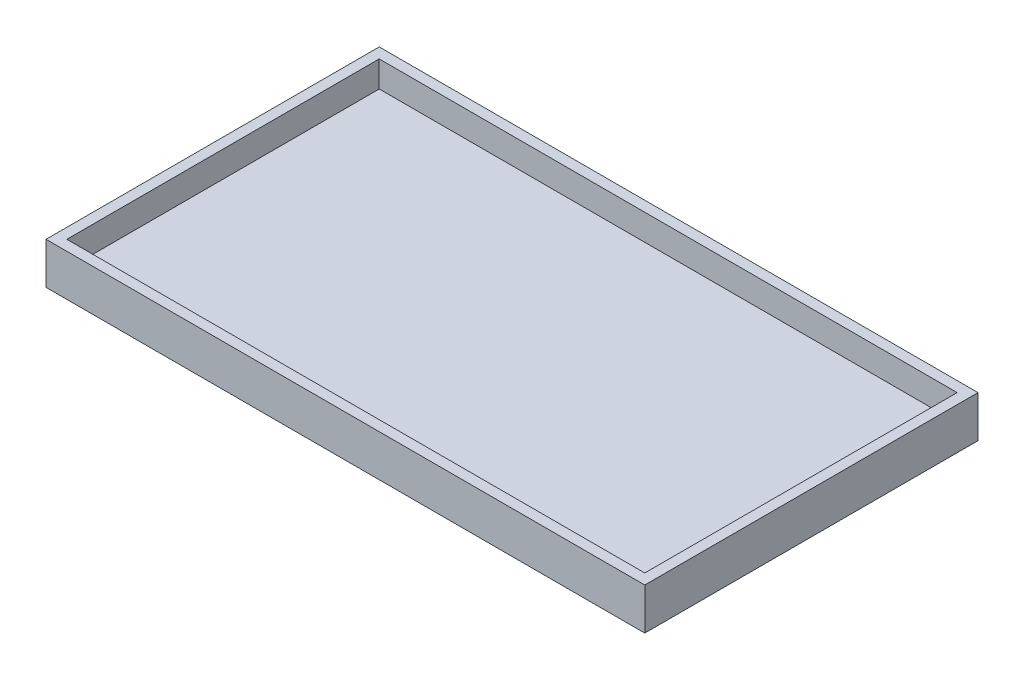
ISO-10303-21;
HEADER;
FILE_DESCRIPTION(('STEP AP214'),'2;1');
FILE_NAME('part.step','',(''),(''),'','','');
FILE_SCHEMA(('AUTOMOTIVE_DESIGN { 1 0 10303 214 1 1 1 1 }'));
ENDSEC;
DATA;
#1=APPLICATION_CONTEXT('core data for automotive mechanical design processes');
#2=APPLICATION_PROTOCOL_DEFINITION('international standard','automotive_design',2000,#1);
#3=PRODUCT_CONTEXT('',#1,'mechanical');
#4=PRODUCT('Part','Part','',(#3));
#5=PRODUCT_RELATED_PRODUCT_CATEGORY('part','',(#4));
#6=PRODUCT_DEFINITION_FORMATION('','',#4);
#7=PRODUCT_DEFINITION_CONTEXT('part definition',#1,'design');
#8=PRODUCT_DEFINITION('design','',#6,#7);
#9=PRODUCT_DEFINITION_SHAPE('','',#8);
#10=(LENGTH_UNIT() NAMED_UNIT(*) SI_UNIT(.MILLI.,.METRE.));
#11=(NAMED_UNIT(*) PLANE_ANGLE_UNIT() SI_UNIT($,.RADIAN.));
#12=(NAMED_UNIT(*) SI_UNIT($,.STERADIAN.) SOLID_ANGLE_UNIT());
#13=UNCERTAINTY_MEASURE_WITH_UNIT(LENGTH_MEASURE(1.E-05),#10,'distance_accuracy_value','');
#14=(GEOMETRIC_REPRESENTATION_CONTEXT(3) GLOBAL_UNCERTAINTY_ASSIGNED_CONTEXT((#13)) GLOBAL_UNIT_ASSIGNED_CONTEXT((#10,
#11,#12)) REPRESENTATION_CONTEXT('',''));
#15=CARTESIAN_POINT('',(0.,0.,0.));
#16=DIRECTION('',(0.,0.,1.));
#17=DIRECTION('',(1.,0.,0.));
#18=AXIS2_PLACEMENT_3D('',#15,#16,#17);
#19=CARTESIAN_POINT('',(-57.5,3.,-32.));
#20=DIRECTION('',(1.,0.,0.));
#21=DIRECTION('',(0.,0.,-1.));
#22=AXIS2_PLACEMENT_3D('',#19,#20,#21);
#23=PLANE('',#22);
#24=DIRECTION('',(0.,0.,1.));
#25=VECTOR('',#24,1.);
#26=CARTESIAN_POINT('',(-57.5,0.,-32.));
#27=LINE('',#26,#25);
#28=CARTESIAN_POINT('',(-57.5,0.,-32.));
#29=VERTEX_POINT('',#28);
#30=CARTESIAN_POINT('',(-57.5,0.,32.));
#31=VERTEX_POINT('',#30);
#32=EDGE_CURVE('E143',#29,#31,#27,.T.);
#33=ORIENTED_EDGE('',*,*,#32,.T.);
#34=DIRECTION('',(0.,-1.,0.));
#35=VECTOR('',#34,1.);
#36=CARTESIAN_POINT('',(-57.5,3.,32.));
#37=LINE('',#36,#35);
#38=CARTESIAN_POINT('',(-57.5,8.,32.));
#39=VERTEX_POINT('',#38);
#40=EDGE_CURVE('E11',#39,#31,#37,.T.);
#41=ORIENTED_EDGE('',*,*,#40,.F.);
#42=DIRECTION('',(0.,0.,1.));
#43=VECTOR('',#42,1.);
#44=CARTESIAN_POINT('',(-57.5,8.,32.));
#45=LINE('',#44,#43);
#46=CARTESIAN_POINT('',(-57.5,8.,-32.));
#47=VERTEX_POINT('',#46);
#48=EDGE_CURVE('E137',#47,#39,#45,.T.);
#49=ORIENTED_EDGE('',*,*,#48,.F.);
#50=DIRECTION('',(0.,-1.,0.));
#51=VECTOR('',#50,1.);
#52=CARTESIAN_POINT('',(-57.5,3.,-32.));
#53=LINE('',#52,#51);
#54=EDGE_CURVE('E152',#47,#29,#53,.T.);
#55=ORIENTED_EDGE('',*,*,#54,.T.);
#56=EDGE_LOOP('',(#33,#41,#49,#55));
#57=FACE_BOUND('',#56,.T.);
#58=ADVANCED_FACE('F32',(#57),#23,.F.);
#59=CARTESIAN_POINT('',(-57.5,3.,32.));
#60=DIRECTION('',(0.,0.,-1.));
#61=DIRECTION('',(-1.,0.,0.));
#62=AXIS2_PLACEMENT_3D('',#59,#60,#61);
#63=PLANE('',#62);
#64=DIRECTION('',(1.,0.,0.));
#65=VECTOR('',#64,1.);
#66=CARTESIAN_POINT('',(-57.5,0.,32.));
#67=LINE('',#66,#65);
#68=CARTESIAN_POINT('',(57.5,0.,32.));
#69=VERTEX_POINT('',#68);
#70=EDGE_CURVE('E146',#31,#69,#67,.T.);
#71=ORIENTED_EDGE('',*,*,#70,.T.);
#72=DIRECTION('',(0.,-1.,0.));
#73=VECTOR('',#72,1.);
#74=CARTESIAN_POINT('',(57.5,3.,32.));
#75=LINE('',#74,#73);
#76=CARTESIAN_POINT('',(57.5,8.,32.));
#77=VERTEX_POINT('',#76);
#78=EDGE_CURVE('E39',#77,#69,#75,.T.);
#79=ORIENTED_EDGE('',*,*,#78,.F.);
#80=DIRECTION('',(1.,0.,0.));
#81=VECTOR('',#80,1.);
#82=CARTESIAN_POINT('',(-57.5,8.,32.));
#83=LINE('',#82,#81);
#84=EDGE_CURVE('E140',#39,#77,#83,.T.);
#85=ORIENTED_EDGE('',*,*,#84,.F.);
#86=ORIENTED_EDGE('',*,*,#40,.T.);
#87=EDGE_LOOP('',(#71,#79,#85,#86));
#88=FACE_BOUND('',#87,.T.);
#89=ADVANCED_FACE('F174',(#88),#63,.F.);
#90=CARTESIAN_POINT('',(57.5,3.,-32.));
#91=DIRECTION('',(-1.,0.,0.));
#92=DIRECTION('',(0.,0.,1.));
#93=AXIS2_PLACEMENT_3D('',#90,#91,#92);
#94=PLANE('',#93);
#95=DIRECTION('',(0.,0.,-1.));
#96=VECTOR('',#95,1.);
#97=CARTESIAN_POINT('',(57.5,0.,-32.));
#98=LINE('',#97,#96);
#99=CARTESIAN_POINT('',(57.5,0.,-32.));
#100=VERTEX_POINT('',#99);
#101=EDGE_CURVE('E148',#69,#100,#98,.T.);
#102=ORIENTED_EDGE('',*,*,#101,.T.);
#103=DIRECTION('',(0.,-1.,0.));
#104=VECTOR('',#103,1.);
#105=CARTESIAN_POINT('',(57.5,3.,-32.));
#106=LINE('',#105,#104);
#107=CARTESIAN_POINT('',(57.5,8.,-32.));
#108=VERTEX_POINT('',#107);
#109=EDGE_CURVE('E155',#108,#100,#106,.T.);
#110=ORIENTED_EDGE('',*,*,#109,.F.);
#111=DIRECTION('',(0.,0.,-1.));
#112=VECTOR('',#111,1.);
#113=CARTESIAN_POINT('',(57.5,8.,32.));
#114=LINE('',#113,#112);
#115=EDGE_CURVE('E110',#77,#108,#114,.T.);
#116=ORIENTED_EDGE('',*,*,#115,.F.);
#117=ORIENTED_EDGE('',*,*,#78,.T.);
#118=EDGE_LOOP('',(#102,#110,#116,#117));
#119=FACE_BOUND('',#118,.T.);
#120=ADVANCED_FACE('F161',(#119),#94,.F.);
#121=CARTESIAN_POINT('',(-57.5,3.,-32.));
#122=DIRECTION('',(0.,0.,1.));
#123=DIRECTION('',(1.,0.,0.));
#124=AXIS2_PLACEMENT_3D('',#121,#122,#123);
#125=PLANE('',#124);
#126=DIRECTION('',(-1.,0.,0.));
#127=VECTOR('',#126,1.);
#128=CARTESIAN_POINT('',(-57.5,0.,-32.));
#129=LINE('',#128,#127);
#130=EDGE_CURVE('E150',#100,#29,#129,.T.);
#131=ORIENTED_EDGE('',*,*,#130,.T.);
#132=ORIENTED_EDGE('',*,*,#54,.F.);
#133=DIRECTION('',(-1.,0.,0.));
#134=VECTOR('',#133,1.);
#135=CARTESIAN_POINT('',(-57.5,8.,-32.));
#136=LINE('',#135,#134);
#137=EDGE_CURVE('E134',#108,#47,#136,.T.);
#138=ORIENTED_EDGE('',*,*,#137,.F.);
#139=ORIENTED_EDGE('',*,*,#109,.T.);
#140=EDGE_LOOP('',(#131,#132,#138,#139));
#141=FACE_BOUND('',#140,.T.);
#142=ADVANCED_FACE('F169',(#141),#125,.F.);
#143=CARTESIAN_POINT('',(0.,0.,0.));
#144=DIRECTION('',(0.,1.,0.));
#145=DIRECTION('',(0.,0.,1.));
#146=AXIS2_PLACEMENT_3D('',#143,#144,#145);
#147=PLANE('',#146);
#148=ORIENTED_EDGE('',*,*,#32,.F.);
#149=ORIENTED_EDGE('',*,*,#130,.F.);
#150=ORIENTED_EDGE('',*,*,#101,.F.);
#151=ORIENTED_EDGE('',*,*,#70,.F.);
#152=EDGE_LOOP('',(#148,#149,#150,#151));
#153=FACE_BOUND('',#152,.T.);
#154=ADVANCED_FACE('F167',(#153),#147,.F.);
#155=CARTESIAN_POINT('',(0.,8.,0.));
#156=DIRECTION('',(0.,-1.,0.));
#157=DIRECTION('',(0.,0.,-1.));
#158=AXIS2_PLACEMENT_3D('',#155,#156,#157);
#159=PLANE('',#158);
#160=ORIENTED_EDGE('',*,*,#115,.T.);
#161=ORIENTED_EDGE('',*,*,#137,.T.);
#162=ORIENTED_EDGE('',*,*,#48,.T.);
#163=ORIENTED_EDGE('',*,*,#84,.T.);
#164=EDGE_LOOP('',(#160,#161,#162,#163));
#165=FACE_BOUND('',#164,.T.);
#166=DIRECTION('',(0.,0.,-1.));
#167=VECTOR('',#166,1.);
#168=CARTESIAN_POINT('',(55.5,8.,30.));
#169=LINE('',#168,#167);
#170=CARTESIAN_POINT('',(55.5,8.,30.));
#171=VERTEX_POINT('',#170);
#172=CARTESIAN_POINT('',(55.5,8.,-30.));
#173=VERTEX_POINT('',#172);
#174=EDGE_CURVE('E95',#171,#173,#169,.T.);
#175=ORIENTED_EDGE('',*,*,#174,.F.);
#176=DIRECTION('',(1.,0.,0.));
#177=VECTOR('',#176,1.);
#178=CARTESIAN_POINT('',(-55.5,8.,30.));
#179=LINE('',#178,#177);
#180=CARTESIAN_POINT('',(-55.5,8.,30.));
#181=VERTEX_POINT('',#180);
#182=EDGE_CURVE('E118',#181,#171,#179,.T.);
#183=ORIENTED_EDGE('',*,*,#182,.F.);
#184=DIRECTION('',(0.,0.,1.));
#185=VECTOR('',#184,1.);
#186=CARTESIAN_POINT('',(-55.5,8.,30.));
#187=LINE('',#186,#185);
#188=CARTESIAN_POINT('',(-55.5,8.,-30.));
#189=VERTEX_POINT('',#188);
#190=EDGE_CURVE('E116',#189,#181,#187,.T.);
#191=ORIENTED_EDGE('',*,*,#190,.F.);
#192=DIRECTION('',(-1.,0.,0.));
#193=VECTOR('',#192,1.);
#194=CARTESIAN_POINT('',(-55.5,8.,-30.));
#195=LINE('',#194,#193);
#196=EDGE_CURVE('E104',#173,#189,#195,.T.);
#197=ORIENTED_EDGE('',*,*,#196,.F.);
#198=EDGE_LOOP('',(#175,#183,#191,#197));
#199=FACE_BOUND('',#198,.T.);
#200=ADVANCED_FACE('F114',(#165,#199),#159,.F.);
#201=CARTESIAN_POINT('',(55.5,8.,30.));
#202=DIRECTION('',(-1.,0.,0.));
#203=DIRECTION('',(0.,0.,1.));
#204=AXIS2_PLACEMENT_3D('',#201,#202,#203);
#205=PLANE('',#204);
#206=DIRECTION('',(0.,0.,-1.));
#207=VECTOR('',#206,1.);
#208=CARTESIAN_POINT('',(55.5,3.,30.));
#209=LINE('',#208,#207);
#210=CARTESIAN_POINT('',(55.5,3.,30.));
#211=VERTEX_POINT('',#210);
#212=CARTESIAN_POINT('',(55.5,3.,-30.));
#213=VERTEX_POINT('',#212);
#214=EDGE_CURVE('E46',#211,#213,#209,.T.);
#215=ORIENTED_EDGE('',*,*,#214,.F.);
#216=DIRECTION('',(0.,-1.,0.));
#217=VECTOR('',#216,1.);
#218=CARTESIAN_POINT('',(55.5,8.,30.));
#219=LINE('',#218,#217);
#220=EDGE_CURVE('E100',#171,#211,#219,.T.);
#221=ORIENTED_EDGE('',*,*,#220,.F.);
#222=ORIENTED_EDGE('',*,*,#174,.T.);
#223=DIRECTION('',(0.,-1.,0.));
#224=VECTOR('',#223,1.);
#225=CARTESIAN_POINT('',(55.5,8.,-30.));
#226=LINE('',#225,#224);
#227=EDGE_CURVE('E98',#173,#213,#226,.T.);
#228=ORIENTED_EDGE('',*,*,#227,.T.);
#229=EDGE_LOOP('',(#215,#221,#222,#228));
#230=FACE_BOUND('',#229,.T.);
#231=ADVANCED_FACE('F97',(#230),#205,.T.);
#232=CARTESIAN_POINT('',(-55.5,8.,-30.));
#233=DIRECTION('',(0.,0.,1.));
#234=DIRECTION('',(1.,0.,0.));
#235=AXIS2_PLACEMENT_3D('',#232,#233,#234);
#236=PLANE('',#235);
#237=DIRECTION('',(-1.,0.,0.));
#238=VECTOR('',#237,1.);
#239=CARTESIAN_POINT('',(-55.5,3.,-30.));
#240=LINE('',#239,#238);
#241=CARTESIAN_POINT('',(-55.5,3.,-30.));
#242=VERTEX_POINT('',#241);
#243=EDGE_CURVE('E50',#213,#242,#240,.T.);
#244=ORIENTED_EDGE('',*,*,#243,.F.);
#245=ORIENTED_EDGE('',*,*,#227,.F.);
#246=ORIENTED_EDGE('',*,*,#196,.T.);
#247=DIRECTION('',(0.,-1.,0.));
#248=VECTOR('',#247,1.);
#249=CARTESIAN_POINT('',(-55.5,8.,-30.));
#250=LINE('',#249,#248);
#251=EDGE_CURVE('E111',#189,#242,#250,.T.);
#252=ORIENTED_EDGE('',*,*,#251,.T.);
#253=EDGE_LOOP('',(#244,#245,#246,#252));
#254=FACE_BOUND('',#253,.T.);
#255=ADVANCED_FACE('F108',(#254),#236,.T.);
#256=CARTESIAN_POINT('',(-55.5,8.,30.));
#257=DIRECTION('',(1.,0.,0.));
#258=DIRECTION('',(0.,0.,-1.));
#259=AXIS2_PLACEMENT_3D('',#256,#257,#258);
#260=PLANE('',#259);
#261=DIRECTION('',(0.,0.,1.));
#262=VECTOR('',#261,1.);
#263=CARTESIAN_POINT('',(-55.5,3.,30.));
#264=LINE('',#263,#262);
#265=CARTESIAN_POINT('',(-55.5,3.,30.));
#266=VERTEX_POINT('',#265);
#267=EDGE_CURVE('E124',#242,#266,#264,.T.);
#268=ORIENTED_EDGE('',*,*,#267,.F.);
#269=ORIENTED_EDGE('',*,*,#251,.F.);
#270=ORIENTED_EDGE('',*,*,#190,.T.);
#271=DIRECTION('',(0.,-1.,0.));
#272=VECTOR('',#271,1.);
#273=CARTESIAN_POINT('',(-55.5,8.,30.));
#274=LINE('',#273,#272);
#275=EDGE_CURVE('E128',#181,#266,#274,.T.);
#276=ORIENTED_EDGE('',*,*,#275,.T.);
#277=EDGE_LOOP('',(#268,#269,#270,#276));
#278=FACE_BOUND('',#277,.T.);
#279=ADVANCED_FACE('F196',(#278),#260,.T.);
#280=CARTESIAN_POINT('',(-55.5,8.,30.));
#281=DIRECTION('',(0.,0.,-1.));
#282=DIRECTION('',(-1.,0.,0.));
#283=AXIS2_PLACEMENT_3D('',#280,#281,#282);
#284=PLANE('',#283);
#285=DIRECTION('',(1.,0.,0.));
#286=VECTOR('',#285,1.);
#287=CARTESIAN_POINT('',(-55.5,3.,30.));
#288=LINE('',#287,#286);
#289=EDGE_CURVE('E105',#266,#211,#288,.T.);
#290=ORIENTED_EDGE('',*,*,#289,.F.);
#291=ORIENTED_EDGE('',*,*,#275,.F.);
#292=ORIENTED_EDGE('',*,*,#182,.T.);
#293=ORIENTED_EDGE('',*,*,#220,.T.);
#294=EDGE_LOOP('',(#290,#291,#292,#293));
#295=FACE_BOUND('',#294,.T.);
#296=ADVANCED_FACE('F189',(#295),#284,.T.);
#297=CARTESIAN_POINT('',(0.,3.,0.));
#298=DIRECTION('',(0.,1.,0.));
#299=DIRECTION('',(0.,0.,1.));
#300=AXIS2_PLACEMENT_3D('',#297,#298,#299);
#301=PLANE('',#300);
#302=ORIENTED_EDGE('',*,*,#214,.T.);
#303=ORIENTED_EDGE('',*,*,#243,.T.);
#304=ORIENTED_EDGE('',*,*,#267,.T.);
#305=ORIENTED_EDGE('',*,*,#289,.T.);
#306=EDGE_LOOP('',(#302,#303,#304,#305));
#307=FACE_BOUND('',#306,.T.);
#308=ADVANCED_FACE('F186',(#307),#301,.T.);
#309=CLOSED_SHELL('',(#58,#89,#120,#142,#154,#200,#231,#255,#279,#296,#308));
#310=MANIFOLD_SOLID_BREP('B2',#309);
#311=ADVANCED_BREP_SHAPE_REPRESENTATION('',(#18,#310),#14);
#312=SHAPE_DEFINITION_REPRESENTATION(#9,#311);
ENDSEC;
END-ISO-10303-21;
